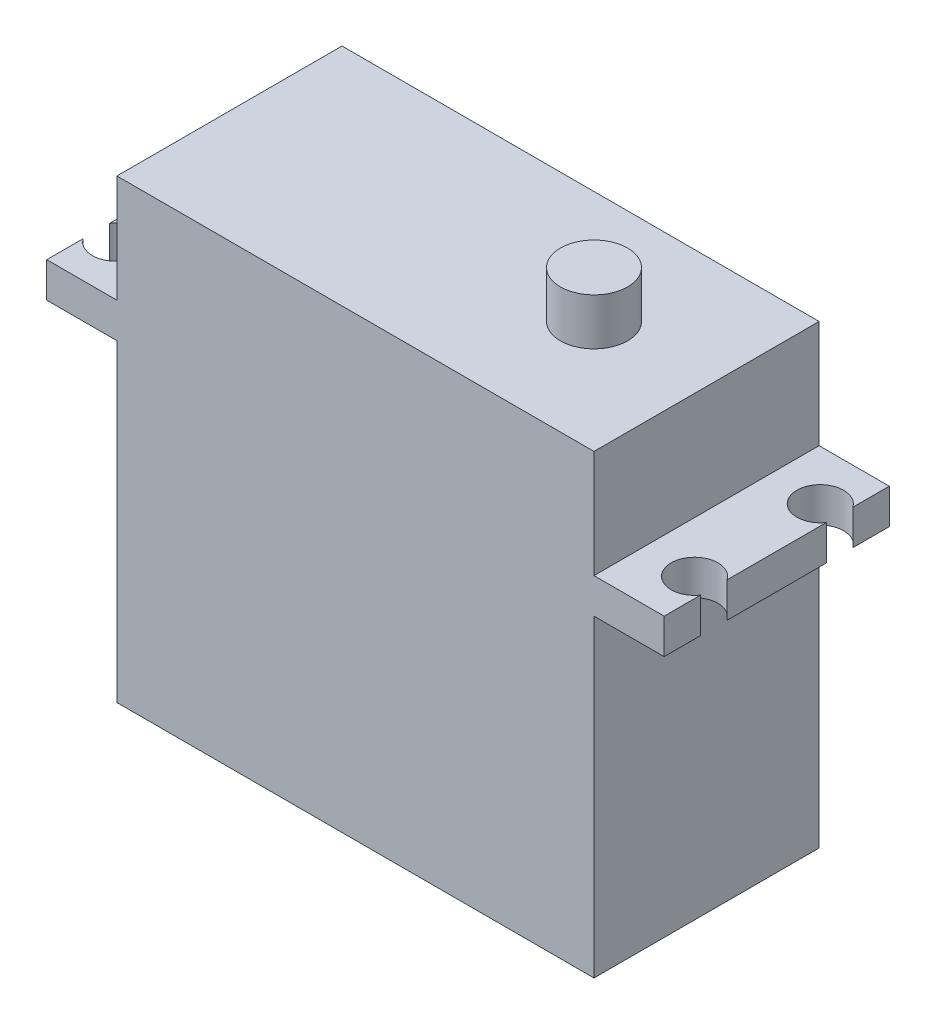
ISO-10303-21;
HEADER;
FILE_DESCRIPTION(('STEP AP214'),'2;1');
FILE_NAME('part.step','',(''),(''),'','','');
FILE_SCHEMA(('AUTOMOTIVE_DESIGN { 1 0 10303 214 1 1 1 1 }'));
ENDSEC;
DATA;
#1=APPLICATION_CONTEXT('core data for automotive mechanical design processes');
#2=APPLICATION_PROTOCOL_DEFINITION('international standard','automotive_design',2000,#1);
#3=PRODUCT_CONTEXT('',#1,'mechanical');
#4=PRODUCT('Part','Part','',(#3));
#5=PRODUCT_RELATED_PRODUCT_CATEGORY('part','',(#4));
#6=PRODUCT_DEFINITION_FORMATION('','',#4);
#7=PRODUCT_DEFINITION_CONTEXT('part definition',#1,'design');
#8=PRODUCT_DEFINITION('design','',#6,#7);
#9=PRODUCT_DEFINITION_SHAPE('','',#8);
#10=(LENGTH_UNIT() NAMED_UNIT(*) SI_UNIT(.MILLI.,.METRE.));
#11=(NAMED_UNIT(*) PLANE_ANGLE_UNIT() SI_UNIT($,.RADIAN.));
#12=(NAMED_UNIT(*) SI_UNIT($,.STERADIAN.) SOLID_ANGLE_UNIT());
#13=UNCERTAINTY_MEASURE_WITH_UNIT(LENGTH_MEASURE(1.E-05),#10,'distance_accuracy_value','');
#14=(GEOMETRIC_REPRESENTATION_CONTEXT(3) GLOBAL_UNCERTAINTY_ASSIGNED_CONTEXT((#13)) GLOBAL_UNIT_ASSIGNED_CONTEXT((#10,
#11,#12)) REPRESENTATION_CONTEXT('',''));
#15=CARTESIAN_POINT('',(0.,0.,0.));
#16=DIRECTION('',(0.,0.,1.));
#17=DIRECTION('',(1.,0.,0.));
#18=AXIS2_PLACEMENT_3D('',#15,#16,#17);
#19=CARTESIAN_POINT('',(46.8,26.8,19.25));
#20=DIRECTION('',(-1.,0.,0.));
#21=DIRECTION('',(0.,0.,1.));
#22=AXIS2_PLACEMENT_3D('',#19,#20,#21);
#23=PLANE('',#22);
#24=DIRECTION('',(0.,0.,-1.));
#25=VECTOR('',#24,1.);
#26=CARTESIAN_POINT('',(46.8,26.8,19.25));
#27=LINE('',#26,#25);
#28=CARTESIAN_POINT('',(46.8,26.8,13.8697345444543));
#29=VERTEX_POINT('',#28);
#30=CARTESIAN_POINT('',(46.8,26.8,5.38026545554574));
#31=VERTEX_POINT('',#30);
#32=EDGE_CURVE('E182',#29,#31,#27,.T.);
#33=ORIENTED_EDGE('',*,*,#32,.T.);
#34=DIRECTION('',(0.,1.,0.));
#35=VECTOR('',#34,1.);
#36=CARTESIAN_POINT('',(46.8,-0.001000000000001,5.38026545554574));
#37=LINE('',#36,#35);
#38=CARTESIAN_POINT('',(46.8,29.8,5.38026545554574));
#39=VERTEX_POINT('',#38);
#40=EDGE_CURVE('E170',#39,#31,#37,.F.);
#41=ORIENTED_EDGE('',*,*,#40,.F.);
#42=DIRECTION('',(0.,0.,-1.));
#43=VECTOR('',#42,1.);
#44=CARTESIAN_POINT('',(46.8,29.8,19.25));
#45=LINE('',#44,#43);
#46=CARTESIAN_POINT('',(46.8,29.8,13.8697345444543));
#47=VERTEX_POINT('',#46);
#48=EDGE_CURVE('E180',#47,#39,#45,.T.);
#49=ORIENTED_EDGE('',*,*,#48,.F.);
#50=DIRECTION('',(0.,1.,0.));
#51=VECTOR('',#50,1.);
#52=CARTESIAN_POINT('',(46.8,-0.001000000000001,13.8697345444543));
#53=LINE('',#52,#51);
#54=EDGE_CURVE('E56',#29,#47,#53,.T.);
#55=ORIENTED_EDGE('',*,*,#54,.F.);
#56=EDGE_LOOP('',(#33,#41,#49,#55));
#57=FACE_BOUND('',#56,.T.);
#58=ADVANCED_FACE('F33',(#57),#23,.F.);
#59=CARTESIAN_POINT('',(46.8,26.8,19.25));
#60=VERTEX_POINT('',#59);
#61=CARTESIAN_POINT('',(46.8,26.8,16.1302654555457));
#62=VERTEX_POINT('',#61);
#63=EDGE_CURVE('E195',#60,#62,#27,.T.);
#64=ORIENTED_EDGE('',*,*,#63,.T.);
#65=DIRECTION('',(0.,1.,0.));
#66=VECTOR('',#65,1.);
#67=CARTESIAN_POINT('',(46.8,-0.001000000000001,16.1302654555457));
#68=LINE('',#67,#66);
#69=CARTESIAN_POINT('',(46.8,29.8,16.1302654555457));
#70=VERTEX_POINT('',#69);
#71=EDGE_CURVE('E329',#70,#62,#68,.F.);
#72=ORIENTED_EDGE('',*,*,#71,.F.);
#73=CARTESIAN_POINT('',(46.8,29.8,19.25));
#74=VERTEX_POINT('',#73);
#75=EDGE_CURVE('E187',#74,#70,#45,.T.);
#76=ORIENTED_EDGE('',*,*,#75,.F.);
#77=DIRECTION('',(0.,1.,0.));
#78=VECTOR('',#77,1.);
#79=CARTESIAN_POINT('',(46.8,26.8,19.25));
#80=LINE('',#79,#78);
#81=EDGE_CURVE('E321',#60,#74,#80,.T.);
#82=ORIENTED_EDGE('',*,*,#81,.F.);
#83=EDGE_LOOP('',(#64,#72,#76,#82));
#84=FACE_BOUND('',#83,.T.);
#85=ADVANCED_FACE('F328',(#84),#23,.F.);
#86=CARTESIAN_POINT('',(-6.,29.8,19.25));
#87=DIRECTION('',(1.,0.,0.));
#88=DIRECTION('',(0.,0.,-1.));
#89=AXIS2_PLACEMENT_3D('',#86,#87,#88);
#90=PLANE('',#89);
#91=DIRECTION('',(0.,0.,-1.));
#92=VECTOR('',#91,1.);
#93=CARTESIAN_POINT('',(-6.,26.8,19.25));
#94=LINE('',#93,#92);
#95=CARTESIAN_POINT('',(-6.,26.8,13.8697345444543));
#96=VERTEX_POINT('',#95);
#97=CARTESIAN_POINT('',(-6.,26.8,5.38026545554574));
#98=VERTEX_POINT('',#97);
#99=EDGE_CURVE('E262',#96,#98,#94,.T.);
#100=ORIENTED_EDGE('',*,*,#99,.F.);
#101=DIRECTION('',(0.,1.,0.));
#102=VECTOR('',#101,1.);
#103=CARTESIAN_POINT('',(-6.,-0.001000000000001,13.8697345444543));
#104=LINE('',#103,#102);
#105=CARTESIAN_POINT('',(-6.,29.8,13.8697345444543));
#106=VERTEX_POINT('',#105);
#107=EDGE_CURVE('E546',#106,#96,#104,.F.);
#108=ORIENTED_EDGE('',*,*,#107,.F.);
#109=DIRECTION('',(0.,0.,-1.));
#110=VECTOR('',#109,1.);
#111=CARTESIAN_POINT('',(-6.,29.8,19.25));
#112=LINE('',#111,#110);
#113=CARTESIAN_POINT('',(-6.,29.8,5.38026545554574));
#114=VERTEX_POINT('',#113);
#115=EDGE_CURVE('E267',#106,#114,#112,.T.);
#116=ORIENTED_EDGE('',*,*,#115,.T.);
#117=DIRECTION('',(0.,1.,0.));
#118=VECTOR('',#117,1.);
#119=CARTESIAN_POINT('',(-6.,-0.001000000000001,5.38026545554574));
#120=LINE('',#119,#118);
#121=EDGE_CURVE('E548',#98,#114,#120,.T.);
#122=ORIENTED_EDGE('',*,*,#121,.F.);
#123=EDGE_LOOP('',(#100,#108,#116,#122));
#124=FACE_BOUND('',#123,.T.);
#125=ADVANCED_FACE('F361',(#124),#90,.F.);
#126=CARTESIAN_POINT('',(-6.,26.8,3.11973454445426));
#127=VERTEX_POINT('',#126);
#128=CARTESIAN_POINT('',(-6.,26.8,0.));
#129=VERTEX_POINT('',#128);
#130=EDGE_CURVE('E257',#127,#129,#94,.T.);
#131=ORIENTED_EDGE('',*,*,#130,.F.);
#132=DIRECTION('',(0.,1.,0.));
#133=VECTOR('',#132,1.);
#134=CARTESIAN_POINT('',(-6.,-0.001000000000001,3.11973454445426));
#135=LINE('',#134,#133);
#136=CARTESIAN_POINT('',(-6.,29.8,3.11973454445426));
#137=VERTEX_POINT('',#136);
#138=EDGE_CURVE('E563',#137,#127,#135,.F.);
#139=ORIENTED_EDGE('',*,*,#138,.F.);
#140=CARTESIAN_POINT('',(-6.,29.8,0.));
#141=VERTEX_POINT('',#140);
#142=EDGE_CURVE('E261',#137,#141,#112,.T.);
#143=ORIENTED_EDGE('',*,*,#142,.T.);
#144=DIRECTION('',(0.,-1.,0.));
#145=VECTOR('',#144,1.);
#146=CARTESIAN_POINT('',(-6.,29.8,0.));
#147=LINE('',#146,#145);
#148=EDGE_CURVE('E250',#141,#129,#147,.T.);
#149=ORIENTED_EDGE('',*,*,#148,.T.);
#150=EDGE_LOOP('',(#131,#139,#143,#149));
#151=FACE_BOUND('',#150,.T.);
#152=ADVANCED_FACE('F385',(#151),#90,.F.);
#153=CARTESIAN_POINT('',(0.,26.8,19.25));
#154=DIRECTION('',(1.,0.,0.));
#155=DIRECTION('',(0.,1.,0.));
#156=AXIS2_PLACEMENT_3D('',#153,#154,#155);
#157=PLANE('',#156);
#158=DIRECTION('',(0.,-1.,0.));
#159=VECTOR('',#158,1.);
#160=CARTESIAN_POINT('',(0.,26.8,0.));
#161=LINE('',#160,#159);
#162=CARTESIAN_POINT('',(0.,26.8,0.));
#163=VERTEX_POINT('',#162);
#164=CARTESIAN_POINT('',(0.,0.,0.));
#165=VERTEX_POINT('',#164);
#166=EDGE_CURVE('E216',#163,#165,#161,.T.);
#167=ORIENTED_EDGE('',*,*,#166,.T.);
#168=DIRECTION('',(0.,0.,-1.));
#169=VECTOR('',#168,1.);
#170=CARTESIAN_POINT('',(0.,0.,19.25));
#171=LINE('',#170,#169);
#172=CARTESIAN_POINT('',(0.,0.,19.25));
#173=VERTEX_POINT('',#172);
#174=EDGE_CURVE('E41',#173,#165,#171,.T.);
#175=ORIENTED_EDGE('',*,*,#174,.F.);
#176=DIRECTION('',(0.,-1.,0.));
#177=VECTOR('',#176,1.);
#178=CARTESIAN_POINT('',(0.,26.8,19.25));
#179=LINE('',#178,#177);
#180=CARTESIAN_POINT('',(0.,26.8,19.25));
#181=VERTEX_POINT('',#180);
#182=EDGE_CURVE('E255',#181,#173,#179,.T.);
#183=ORIENTED_EDGE('',*,*,#182,.F.);
#184=DIRECTION('',(0.,0.,-1.));
#185=VECTOR('',#184,1.);
#186=CARTESIAN_POINT('',(0.,26.8,19.25));
#187=LINE('',#186,#185);
#188=EDGE_CURVE('E218',#181,#163,#187,.T.);
#189=ORIENTED_EDGE('',*,*,#188,.T.);
#190=EDGE_LOOP('',(#167,#175,#183,#189));
#191=FACE_BOUND('',#190,.T.);
#192=ADVANCED_FACE('F35',(#191),#157,.F.);
#193=CARTESIAN_POINT('',(0.,0.,19.25));
#194=DIRECTION('',(0.,1.,0.));
#195=DIRECTION('',(0.,0.,1.));
#196=AXIS2_PLACEMENT_3D('',#193,#194,#195);
#197=PLANE('',#196);
#198=DIRECTION('',(1.,0.,0.));
#199=VECTOR('',#198,1.);
#200=CARTESIAN_POINT('',(0.,0.,0.));
#201=LINE('',#200,#199);
#202=CARTESIAN_POINT('',(40.8,0.,0.));
#203=VERTEX_POINT('',#202);
#204=EDGE_CURVE('E209',#165,#203,#201,.T.);
#205=ORIENTED_EDGE('',*,*,#204,.T.);
#206=DIRECTION('',(0.,0.,-1.));
#207=VECTOR('',#206,1.);
#208=CARTESIAN_POINT('',(40.8,0.,19.25));
#209=LINE('',#208,#207);
#210=CARTESIAN_POINT('',(40.8,0.,19.25));
#211=VERTEX_POINT('',#210);
#212=EDGE_CURVE('E201',#211,#203,#209,.T.);
#213=ORIENTED_EDGE('',*,*,#212,.F.);
#214=DIRECTION('',(1.,0.,0.));
#215=VECTOR('',#214,1.);
#216=CARTESIAN_POINT('',(0.,0.,19.25));
#217=LINE('',#216,#215);
#218=EDGE_CURVE('E210',#173,#211,#217,.T.);
#219=ORIENTED_EDGE('',*,*,#218,.F.);
#220=ORIENTED_EDGE('',*,*,#174,.T.);
#221=EDGE_LOOP('',(#205,#213,#219,#220));
#222=FACE_BOUND('',#221,.T.);
#223=ADVANCED_FACE('F207',(#222),#197,.F.);
#224=CARTESIAN_POINT('',(40.8,0.,19.25));
#225=DIRECTION('',(-1.,0.,0.));
#226=DIRECTION('',(0.,0.,1.));
#227=AXIS2_PLACEMENT_3D('',#224,#225,#226);
#228=PLANE('',#227);
#229=DIRECTION('',(0.,1.,0.));
#230=VECTOR('',#229,1.);
#231=CARTESIAN_POINT('',(40.8,0.,0.));
#232=LINE('',#231,#230);
#233=CARTESIAN_POINT('',(40.8,26.8,0.));
#234=VERTEX_POINT('',#233);
#235=EDGE_CURVE('E223',#203,#234,#232,.T.);
#236=ORIENTED_EDGE('',*,*,#235,.T.);
#237=DIRECTION('',(0.,0.,-1.));
#238=VECTOR('',#237,1.);
#239=CARTESIAN_POINT('',(40.8,26.8,19.25));
#240=LINE('',#239,#238);
#241=CARTESIAN_POINT('',(40.8,26.8,19.25));
#242=VERTEX_POINT('',#241);
#243=EDGE_CURVE('E198',#242,#234,#240,.T.);
#244=ORIENTED_EDGE('',*,*,#243,.F.);
#245=DIRECTION('',(0.,1.,0.));
#246=VECTOR('',#245,1.);
#247=CARTESIAN_POINT('',(40.8,0.,19.25));
#248=LINE('',#247,#246);
#249=EDGE_CURVE('E314',#211,#242,#248,.T.);
#250=ORIENTED_EDGE('',*,*,#249,.F.);
#251=ORIENTED_EDGE('',*,*,#212,.T.);
#252=EDGE_LOOP('',(#236,#244,#250,#251));
#253=FACE_BOUND('',#252,.T.);
#254=ADVANCED_FACE('F347',(#253),#228,.F.);
#255=CARTESIAN_POINT('',(40.8,26.8,19.25));
#256=DIRECTION('',(0.,1.,0.));
#257=DIRECTION('',(0.,0.,1.));
#258=AXIS2_PLACEMENT_3D('',#255,#256,#257);
#259=PLANE('',#258);
#260=CARTESIAN_POINT('',(46.8,26.8,3.11973454445426));
#261=VERTEX_POINT('',#260);
#262=CARTESIAN_POINT('',(46.8,26.8,0.));
#263=VERTEX_POINT('',#262);
#264=EDGE_CURVE('E190',#261,#263,#27,.T.);
#265=ORIENTED_EDGE('',*,*,#264,.F.);
#266=CARTESIAN_POINT('',(45.15,26.8,4.25));
#267=DIRECTION('',(0.,1.,0.));
#268=DIRECTION('',(0.,0.,1.));
#269=AXIS2_PLACEMENT_3D('',#266,#267,#268);
#270=CIRCLE('',#269,2.);
#271=EDGE_CURVE('E175',#31,#261,#270,.F.);
#272=ORIENTED_EDGE('',*,*,#271,.F.);
#273=ORIENTED_EDGE('',*,*,#32,.F.);
#274=CARTESIAN_POINT('',(45.15,26.8,15.));
#275=DIRECTION('',(0.,1.,0.));
#276=DIRECTION('',(0.,0.,1.));
#277=AXIS2_PLACEMENT_3D('',#274,#275,#276);
#278=CIRCLE('',#277,2.);
#279=EDGE_CURVE('E226',#62,#29,#278,.F.);
#280=ORIENTED_EDGE('',*,*,#279,.F.);
#281=ORIENTED_EDGE('',*,*,#63,.F.);
#282=DIRECTION('',(1.,0.,0.));
#283=VECTOR('',#282,1.);
#284=CARTESIAN_POINT('',(40.8,26.8,19.25));
#285=LINE('',#284,#283);
#286=EDGE_CURVE('E319',#242,#60,#285,.T.);
#287=ORIENTED_EDGE('',*,*,#286,.F.);
#288=ORIENTED_EDGE('',*,*,#243,.T.);
#289=DIRECTION('',(1.,0.,0.));
#290=VECTOR('',#289,1.);
#291=CARTESIAN_POINT('',(40.8,26.8,0.));
#292=LINE('',#291,#290);
#293=EDGE_CURVE('E233',#234,#263,#292,.T.);
#294=ORIENTED_EDGE('',*,*,#293,.T.);
#295=EDGE_LOOP('',(#265,#272,#273,#280,#281,#287,#288,#294));
#296=FACE_BOUND('',#295,.T.);
#297=ADVANCED_FACE('F339',(#296),#259,.F.);
#298=CARTESIAN_POINT('',(46.8,29.8,3.11973454445426));
#299=VERTEX_POINT('',#298);
#300=CARTESIAN_POINT('',(46.8,29.8,0.));
#301=VERTEX_POINT('',#300);
#302=EDGE_CURVE('E188',#299,#301,#45,.T.);
#303=ORIENTED_EDGE('',*,*,#302,.F.);
#304=DIRECTION('',(0.,1.,0.));
#305=VECTOR('',#304,1.);
#306=CARTESIAN_POINT('',(46.8,-0.001000000000001,3.11973454445426));
#307=LINE('',#306,#305);
#308=EDGE_CURVE('E48',#261,#299,#307,.T.);
#309=ORIENTED_EDGE('',*,*,#308,.F.);
#310=ORIENTED_EDGE('',*,*,#264,.T.);
#311=DIRECTION('',(0.,1.,0.));
#312=VECTOR('',#311,1.);
#313=CARTESIAN_POINT('',(46.8,26.8,0.));
#314=LINE('',#313,#312);
#315=EDGE_CURVE('E236',#263,#301,#314,.T.);
#316=ORIENTED_EDGE('',*,*,#315,.T.);
#317=EDGE_LOOP('',(#303,#309,#310,#316));
#318=FACE_BOUND('',#317,.T.);
#319=ADVANCED_FACE('F341',(#318),#23,.F.);
#320=CARTESIAN_POINT('',(46.8,29.8,19.25));
#321=DIRECTION('',(0.,-1.,0.));
#322=DIRECTION('',(0.,0.,-1.));
#323=AXIS2_PLACEMENT_3D('',#320,#321,#322);
#324=PLANE('',#323);
#325=ORIENTED_EDGE('',*,*,#48,.T.);
#326=CARTESIAN_POINT('',(45.15,29.8,4.25));
#327=DIRECTION('',(0.,1.,0.));
#328=DIRECTION('',(0.,0.,1.));
#329=AXIS2_PLACEMENT_3D('',#326,#327,#328);
#330=CIRCLE('',#329,2.);
#331=EDGE_CURVE('E167',#299,#39,#330,.T.);
#332=ORIENTED_EDGE('',*,*,#331,.F.);
#333=ORIENTED_EDGE('',*,*,#302,.T.);
#334=DIRECTION('',(-1.,0.,0.));
#335=VECTOR('',#334,1.);
#336=CARTESIAN_POINT('',(46.8,29.8,0.));
#337=LINE('',#336,#335);
#338=CARTESIAN_POINT('',(40.8,29.8,0.));
#339=VERTEX_POINT('',#338);
#340=EDGE_CURVE('E239',#301,#339,#337,.T.);
#341=ORIENTED_EDGE('',*,*,#340,.T.);
#342=DIRECTION('',(0.,0.,-1.));
#343=VECTOR('',#342,1.);
#344=CARTESIAN_POINT('',(40.8,29.8,19.25));
#345=LINE('',#344,#343);
#346=CARTESIAN_POINT('',(40.8,29.8,19.25));
#347=VERTEX_POINT('',#346);
#348=EDGE_CURVE('E191',#347,#339,#345,.T.);
#349=ORIENTED_EDGE('',*,*,#348,.F.);
#350=DIRECTION('',(-1.,0.,0.));
#351=VECTOR('',#350,1.);
#352=CARTESIAN_POINT('',(46.8,29.8,19.25));
#353=LINE('',#352,#351);
#354=EDGE_CURVE('E323',#74,#347,#353,.T.);
#355=ORIENTED_EDGE('',*,*,#354,.F.);
#356=ORIENTED_EDGE('',*,*,#75,.T.);
#357=CARTESIAN_POINT('',(45.15,29.8,15.));
#358=DIRECTION('',(0.,1.,0.));
#359=DIRECTION('',(0.,0.,1.));
#360=AXIS2_PLACEMENT_3D('',#357,#358,#359);
#361=CIRCLE('',#360,2.);
#362=EDGE_CURVE('E186',#47,#70,#361,.T.);
#363=ORIENTED_EDGE('',*,*,#362,.F.);
#364=EDGE_LOOP('',(#325,#332,#333,#341,#349,#355,#356,#363));
#365=FACE_BOUND('',#364,.T.);
#366=ADVANCED_FACE('F184',(#365),#324,.F.);
#367=CARTESIAN_POINT('',(40.8,29.8,19.25));
#368=DIRECTION('',(-1.,0.,0.));
#369=DIRECTION('',(0.,0.,1.));
#370=AXIS2_PLACEMENT_3D('',#367,#368,#369);
#371=PLANE('',#370);
#372=DIRECTION('',(0.,1.,0.));
#373=VECTOR('',#372,1.);
#374=CARTESIAN_POINT('',(40.8,29.8,0.));
#375=LINE('',#374,#373);
#376=CARTESIAN_POINT('',(40.8,39.,0.));
#377=VERTEX_POINT('',#376);
#378=EDGE_CURVE('E241',#339,#377,#375,.T.);
#379=ORIENTED_EDGE('',*,*,#378,.T.);
#380=DIRECTION('',(0.,0.,-1.));
#381=VECTOR('',#380,1.);
#382=CARTESIAN_POINT('',(40.8,39.,19.25));
#383=LINE('',#382,#381);
#384=CARTESIAN_POINT('',(40.8,39.,19.25));
#385=VERTEX_POINT('',#384);
#386=EDGE_CURVE('E272',#385,#377,#383,.T.);
#387=ORIENTED_EDGE('',*,*,#386,.F.);
#388=DIRECTION('',(0.,1.,0.));
#389=VECTOR('',#388,1.);
#390=CARTESIAN_POINT('',(40.8,29.8,19.25));
#391=LINE('',#390,#389);
#392=EDGE_CURVE('E284',#347,#385,#391,.T.);
#393=ORIENTED_EDGE('',*,*,#392,.F.);
#394=ORIENTED_EDGE('',*,*,#348,.T.);
#395=EDGE_LOOP('',(#379,#387,#393,#394));
#396=FACE_BOUND('',#395,.T.);
#397=ADVANCED_FACE('F283',(#396),#371,.F.);
#398=CARTESIAN_POINT('',(40.8,39.,19.25));
#399=DIRECTION('',(0.,-1.,0.));
#400=DIRECTION('',(1.,0.,0.));
#401=AXIS2_PLACEMENT_3D('',#398,#399,#400);
#402=PLANE('',#401);
#403=CARTESIAN_POINT('',(31.175,39.,9.625));
#404=DIRECTION('',(0.,-1.,0.));
#405=DIRECTION('',(1.,0.,0.));
#406=AXIS2_PLACEMENT_3D('',#403,#404,#405);
#407=CIRCLE('',#406,2.875);
#408=CARTESIAN_POINT('',(34.05,39.,9.625));
#409=VERTEX_POINT('',#408);
#410=EDGE_CURVE('E11',#409,#409,#407,.F.);
#411=ORIENTED_EDGE('',*,*,#410,.F.);
#412=EDGE_LOOP('',(#411));
#413=FACE_BOUND('',#412,.T.);
#414=DIRECTION('',(-1.,0.,0.));
#415=VECTOR('',#414,1.);
#416=CARTESIAN_POINT('',(40.8,39.,0.));
#417=LINE('',#416,#415);
#418=CARTESIAN_POINT('',(0.,39.,0.));
#419=VERTEX_POINT('',#418);
#420=EDGE_CURVE('E243',#377,#419,#417,.T.);
#421=ORIENTED_EDGE('',*,*,#420,.T.);
#422=DIRECTION('',(0.,0.,-1.));
#423=VECTOR('',#422,1.);
#424=CARTESIAN_POINT('',(0.,39.,19.25));
#425=LINE('',#424,#423);
#426=CARTESIAN_POINT('',(0.,39.,19.25));
#427=VERTEX_POINT('',#426);
#428=EDGE_CURVE('E270',#427,#419,#425,.T.);
#429=ORIENTED_EDGE('',*,*,#428,.F.);
#430=DIRECTION('',(-1.,0.,0.));
#431=VECTOR('',#430,1.);
#432=CARTESIAN_POINT('',(40.8,39.,19.25));
#433=LINE('',#432,#431);
#434=EDGE_CURVE('E301',#385,#427,#433,.T.);
#435=ORIENTED_EDGE('',*,*,#434,.F.);
#436=ORIENTED_EDGE('',*,*,#386,.T.);
#437=EDGE_LOOP('',(#421,#429,#435,#436));
#438=FACE_BOUND('',#437,.T.);
#439=ADVANCED_FACE('F292',(#413,#438),#402,.F.);
#440=CARTESIAN_POINT('',(0.,39.,19.25));
#441=DIRECTION('',(1.,0.,0.));
#442=DIRECTION('',(0.,1.,0.));
#443=AXIS2_PLACEMENT_3D('',#440,#441,#442);
#444=PLANE('',#443);
#445=DIRECTION('',(0.,-1.,0.));
#446=VECTOR('',#445,1.);
#447=CARTESIAN_POINT('',(0.,39.,0.));
#448=LINE('',#447,#446);
#449=CARTESIAN_POINT('',(0.,29.8,0.));
#450=VERTEX_POINT('',#449);
#451=EDGE_CURVE('E245',#419,#450,#448,.T.);
#452=ORIENTED_EDGE('',*,*,#451,.T.);
#453=DIRECTION('',(0.,0.,-1.));
#454=VECTOR('',#453,1.);
#455=CARTESIAN_POINT('',(0.,29.8,19.25));
#456=LINE('',#455,#454);
#457=CARTESIAN_POINT('',(0.,29.8,19.25));
#458=VERTEX_POINT('',#457);
#459=EDGE_CURVE('E266',#458,#450,#456,.T.);
#460=ORIENTED_EDGE('',*,*,#459,.F.);
#461=DIRECTION('',(0.,-1.,0.));
#462=VECTOR('',#461,1.);
#463=CARTESIAN_POINT('',(0.,39.,19.25));
#464=LINE('',#463,#462);
#465=EDGE_CURVE('E297',#427,#458,#464,.T.);
#466=ORIENTED_EDGE('',*,*,#465,.F.);
#467=ORIENTED_EDGE('',*,*,#428,.T.);
#468=EDGE_LOOP('',(#452,#460,#466,#467));
#469=FACE_BOUND('',#468,.T.);
#470=ADVANCED_FACE('F295',(#469),#444,.F.);
#471=CARTESIAN_POINT('',(0.,29.8,19.25));
#472=DIRECTION('',(0.,-1.,0.));
#473=DIRECTION('',(0.,0.,-1.));
#474=AXIS2_PLACEMENT_3D('',#471,#472,#473);
#475=PLANE('',#474);
#476=ORIENTED_EDGE('',*,*,#115,.F.);
#477=CARTESIAN_POINT('',(-4.35,29.8,15.));
#478=DIRECTION('',(0.,1.,0.));
#479=DIRECTION('',(0.,0.,-1.));
#480=AXIS2_PLACEMENT_3D('',#477,#478,#479);
#481=CIRCLE('',#480,2.);
#482=CARTESIAN_POINT('',(-6.,29.8,16.1302654555457));
#483=VERTEX_POINT('',#482);
#484=EDGE_CURVE('E559',#483,#106,#481,.T.);
#485=ORIENTED_EDGE('',*,*,#484,.F.);
#486=CARTESIAN_POINT('',(-6.,29.8,19.25));
#487=VERTEX_POINT('',#486);
#488=EDGE_CURVE('E263',#487,#483,#112,.T.);
#489=ORIENTED_EDGE('',*,*,#488,.F.);
#490=DIRECTION('',(-1.,0.,0.));
#491=VECTOR('',#490,1.);
#492=CARTESIAN_POINT('',(0.,29.8,19.25));
#493=LINE('',#492,#491);
#494=EDGE_CURVE('E300',#458,#487,#493,.T.);
#495=ORIENTED_EDGE('',*,*,#494,.F.);
#496=ORIENTED_EDGE('',*,*,#459,.T.);
#497=DIRECTION('',(-1.,0.,0.));
#498=VECTOR('',#497,1.);
#499=CARTESIAN_POINT('',(0.,29.8,0.));
#500=LINE('',#499,#498);
#501=EDGE_CURVE('E247',#450,#141,#500,.T.);
#502=ORIENTED_EDGE('',*,*,#501,.T.);
#503=ORIENTED_EDGE('',*,*,#142,.F.);
#504=CARTESIAN_POINT('',(-4.35,29.8,4.25));
#505=DIRECTION('',(0.,1.,0.));
#506=DIRECTION('',(0.,0.,-1.));
#507=AXIS2_PLACEMENT_3D('',#504,#505,#506);
#508=CIRCLE('',#507,2.);
#509=EDGE_CURVE('E570',#114,#137,#508,.T.);
#510=ORIENTED_EDGE('',*,*,#509,.F.);
#511=EDGE_LOOP('',(#476,#485,#489,#495,#496,#502,#503,#510));
#512=FACE_BOUND('',#511,.T.);
#513=ADVANCED_FACE('F377',(#512),#475,.F.);
#514=ORIENTED_EDGE('',*,*,#488,.T.);
#515=DIRECTION('',(0.,1.,0.));
#516=VECTOR('',#515,1.);
#517=CARTESIAN_POINT('',(-6.,-0.001000000000001,16.1302654555457));
#518=LINE('',#517,#516);
#519=CARTESIAN_POINT('',(-6.,26.8,16.1302654555457));
#520=VERTEX_POINT('',#519);
#521=EDGE_CURVE('E561',#520,#483,#518,.T.);
#522=ORIENTED_EDGE('',*,*,#521,.F.);
#523=CARTESIAN_POINT('',(-6.,26.8,19.25));
#524=VERTEX_POINT('',#523);
#525=EDGE_CURVE('E258',#524,#520,#94,.T.);
#526=ORIENTED_EDGE('',*,*,#525,.F.);
#527=DIRECTION('',(0.,-1.,0.));
#528=VECTOR('',#527,1.);
#529=CARTESIAN_POINT('',(-6.,29.8,19.25));
#530=LINE('',#529,#528);
#531=EDGE_CURVE('E303',#487,#524,#530,.T.);
#532=ORIENTED_EDGE('',*,*,#531,.F.);
#533=EDGE_LOOP('',(#514,#522,#526,#532));
#534=FACE_BOUND('',#533,.T.);
#535=ADVANCED_FACE('F380',(#534),#90,.F.);
#536=CARTESIAN_POINT('',(-6.,26.8,19.25));
#537=DIRECTION('',(0.,1.,0.));
#538=DIRECTION('',(0.,0.,1.));
#539=AXIS2_PLACEMENT_3D('',#536,#537,#538);
#540=PLANE('',#539);
#541=ORIENTED_EDGE('',*,*,#525,.T.);
#542=CARTESIAN_POINT('',(-4.35,26.8,15.));
#543=DIRECTION('',(0.,1.,0.));
#544=DIRECTION('',(0.,0.,1.));
#545=AXIS2_PLACEMENT_3D('',#542,#543,#544);
#546=CIRCLE('',#545,2.);
#547=EDGE_CURVE('E562',#96,#520,#546,.F.);
#548=ORIENTED_EDGE('',*,*,#547,.F.);
#549=ORIENTED_EDGE('',*,*,#99,.T.);
#550=CARTESIAN_POINT('',(-4.35,26.8,4.25));
#551=DIRECTION('',(0.,1.,0.));
#552=DIRECTION('',(0.,0.,1.));
#553=AXIS2_PLACEMENT_3D('',#550,#551,#552);
#554=CIRCLE('',#553,2.);
#555=EDGE_CURVE('E552',#127,#98,#554,.F.);
#556=ORIENTED_EDGE('',*,*,#555,.F.);
#557=ORIENTED_EDGE('',*,*,#130,.T.);
#558=DIRECTION('',(1.,0.,0.));
#559=VECTOR('',#558,1.);
#560=CARTESIAN_POINT('',(-6.,26.8,0.));
#561=LINE('',#560,#559);
#562=EDGE_CURVE('E253',#129,#163,#561,.T.);
#563=ORIENTED_EDGE('',*,*,#562,.T.);
#564=ORIENTED_EDGE('',*,*,#188,.F.);
#565=DIRECTION('',(1.,0.,0.));
#566=VECTOR('',#565,1.);
#567=CARTESIAN_POINT('',(-6.,26.8,19.25));
#568=LINE('',#567,#566);
#569=EDGE_CURVE('E229',#524,#181,#568,.T.);
#570=ORIENTED_EDGE('',*,*,#569,.F.);
#571=EDGE_LOOP('',(#541,#548,#549,#556,#557,#563,#564,#570));
#572=FACE_BOUND('',#571,.T.);
#573=ADVANCED_FACE('F312',(#572),#540,.F.);
#574=CARTESIAN_POINT('',(0.,0.,19.25));
#575=DIRECTION('',(0.,0.,1.));
#576=DIRECTION('',(1.,0.,0.));
#577=AXIS2_PLACEMENT_3D('',#574,#575,#576);
#578=PLANE('',#577);
#579=ORIENTED_EDGE('',*,*,#182,.T.);
#580=ORIENTED_EDGE('',*,*,#218,.T.);
#581=ORIENTED_EDGE('',*,*,#249,.T.);
#582=ORIENTED_EDGE('',*,*,#286,.T.);
#583=ORIENTED_EDGE('',*,*,#81,.T.);
#584=ORIENTED_EDGE('',*,*,#354,.T.);
#585=ORIENTED_EDGE('',*,*,#392,.T.);
#586=ORIENTED_EDGE('',*,*,#434,.T.);
#587=ORIENTED_EDGE('',*,*,#465,.T.);
#588=ORIENTED_EDGE('',*,*,#494,.T.);
#589=ORIENTED_EDGE('',*,*,#531,.T.);
#590=ORIENTED_EDGE('',*,*,#569,.T.);
#591=EDGE_LOOP('',(#579,#580,#581,#582,#583,#584,#585,#586,#587,#588,#589,#590));
#592=FACE_BOUND('',#591,.T.);
#593=ADVANCED_FACE('F310',(#592),#578,.T.);
#594=CARTESIAN_POINT('',(0.,0.,0.));
#595=DIRECTION('',(0.,0.,1.));
#596=DIRECTION('',(1.,0.,0.));
#597=AXIS2_PLACEMENT_3D('',#594,#595,#596);
#598=PLANE('',#597);
#599=ORIENTED_EDGE('',*,*,#166,.F.);
#600=ORIENTED_EDGE('',*,*,#562,.F.);
#601=ORIENTED_EDGE('',*,*,#148,.F.);
#602=ORIENTED_EDGE('',*,*,#501,.F.);
#603=ORIENTED_EDGE('',*,*,#451,.F.);
#604=ORIENTED_EDGE('',*,*,#420,.F.);
#605=ORIENTED_EDGE('',*,*,#378,.F.);
#606=ORIENTED_EDGE('',*,*,#340,.F.);
#607=ORIENTED_EDGE('',*,*,#315,.F.);
#608=ORIENTED_EDGE('',*,*,#293,.F.);
#609=ORIENTED_EDGE('',*,*,#235,.F.);
#610=ORIENTED_EDGE('',*,*,#204,.F.);
#611=EDGE_LOOP('',(#599,#600,#601,#602,#603,#604,#605,#606,#607,#608,#609,#610));
#612=FACE_BOUND('',#611,.T.);
#613=ADVANCED_FACE('F287',(#612),#598,.F.);
#614=CARTESIAN_POINT('',(31.175,43.,9.625));
#615=DIRECTION('',(0.,-1.,0.));
#616=DIRECTION('',(1.,0.,0.));
#617=AXIS2_PLACEMENT_3D('',#614,#615,#616);
#618=CYLINDRICAL_SURFACE('',#617,2.875);
#619=CARTESIAN_POINT('',(31.175,43.,9.625));
#620=DIRECTION('',(0.,1.,0.));
#621=DIRECTION('',(-1.,0.,0.));
#622=AXIS2_PLACEMENT_3D('',#619,#620,#621);
#623=CIRCLE('',#622,2.875);
#624=CARTESIAN_POINT('',(28.3,43.,9.625));
#625=VERTEX_POINT('',#624);
#626=EDGE_CURVE('E221',#625,#625,#623,.T.);
#627=ORIENTED_EDGE('',*,*,#626,.F.);
#628=EDGE_LOOP('',(#627));
#629=FACE_BOUND('',#628,.T.);
#630=ORIENTED_EDGE('',*,*,#410,.T.);
#631=EDGE_LOOP('',(#630));
#632=FACE_BOUND('',#631,.T.);
#633=ADVANCED_FACE('F390',(#629,#632),#618,.T.);
#634=CARTESIAN_POINT('',(31.175,43.,9.625));
#635=DIRECTION('',(0.,1.,0.));
#636=DIRECTION('',(-1.,0.,0.));
#637=AXIS2_PLACEMENT_3D('',#634,#635,#636);
#638=PLANE('',#637);
#639=ORIENTED_EDGE('',*,*,#626,.T.);
#640=EDGE_LOOP('',(#639));
#641=FACE_BOUND('',#640,.T.);
#642=ADVANCED_FACE('F395',(#641),#638,.T.);
#643=CARTESIAN_POINT('',(-4.35,-0.001000000000001,4.25));
#644=DIRECTION('',(0.,1.,0.));
#645=DIRECTION('',(0.,0.,1.));
#646=AXIS2_PLACEMENT_3D('',#643,#644,#645);
#647=CYLINDRICAL_SURFACE('',#646,2.);
#648=ORIENTED_EDGE('',*,*,#138,.T.);
#649=ORIENTED_EDGE('',*,*,#555,.T.);
#650=ORIENTED_EDGE('',*,*,#121,.T.);
#651=ORIENTED_EDGE('',*,*,#509,.T.);
#652=EDGE_LOOP('',(#648,#649,#650,#651));
#653=FACE_BOUND('',#652,.T.);
#654=ADVANCED_FACE('F399',(#653),#647,.F.);
#655=CARTESIAN_POINT('',(-4.35,-0.001000000000001,15.));
#656=DIRECTION('',(0.,1.,0.));
#657=DIRECTION('',(0.,0.,1.));
#658=AXIS2_PLACEMENT_3D('',#655,#656,#657);
#659=CYLINDRICAL_SURFACE('',#658,2.);
#660=ORIENTED_EDGE('',*,*,#107,.T.);
#661=ORIENTED_EDGE('',*,*,#547,.T.);
#662=ORIENTED_EDGE('',*,*,#521,.T.);
#663=ORIENTED_EDGE('',*,*,#484,.T.);
#664=EDGE_LOOP('',(#660,#661,#662,#663));
#665=FACE_BOUND('',#664,.T.);
#666=ADVANCED_FACE('F403',(#665),#659,.F.);
#667=CARTESIAN_POINT('',(45.15,-0.001000000000001,15.));
#668=DIRECTION('',(0.,1.,0.));
#669=DIRECTION('',(0.,0.,1.));
#670=AXIS2_PLACEMENT_3D('',#667,#668,#669);
#671=CYLINDRICAL_SURFACE('',#670,2.);
#672=ORIENTED_EDGE('',*,*,#71,.T.);
#673=ORIENTED_EDGE('',*,*,#279,.T.);
#674=ORIENTED_EDGE('',*,*,#54,.T.);
#675=ORIENTED_EDGE('',*,*,#362,.T.);
#676=EDGE_LOOP('',(#672,#673,#674,#675));
#677=FACE_BOUND('',#676,.T.);
#678=ADVANCED_FACE('F336',(#677),#671,.F.);
#679=CARTESIAN_POINT('',(45.15,-0.001000000000001,4.25));
#680=DIRECTION('',(0.,1.,0.));
#681=DIRECTION('',(0.,0.,1.));
#682=AXIS2_PLACEMENT_3D('',#679,#680,#681);
#683=CYLINDRICAL_SURFACE('',#682,2.);
#684=ORIENTED_EDGE('',*,*,#40,.T.);
#685=ORIENTED_EDGE('',*,*,#271,.T.);
#686=ORIENTED_EDGE('',*,*,#308,.T.);
#687=ORIENTED_EDGE('',*,*,#331,.T.);
#688=EDGE_LOOP('',(#684,#685,#686,#687));
#689=FACE_BOUND('',#688,.T.);
#690=ADVANCED_FACE('F169',(#689),#683,.F.);
#691=CLOSED_SHELL('',(#58,#85,#125,#152,#192,#223,#254,#297,#319,#366,#397,#439,#470,#513,#535,
#573,#593,#613,#633,#642,#654,#666,#678,#690));
#692=MANIFOLD_SOLID_BREP('B2',#691);
#693=ADVANCED_BREP_SHAPE_REPRESENTATION('',(#18,#692),#14);
#694=SHAPE_DEFINITION_REPRESENTATION(#9,#693);
ENDSEC;
END-ISO-10303-21;
